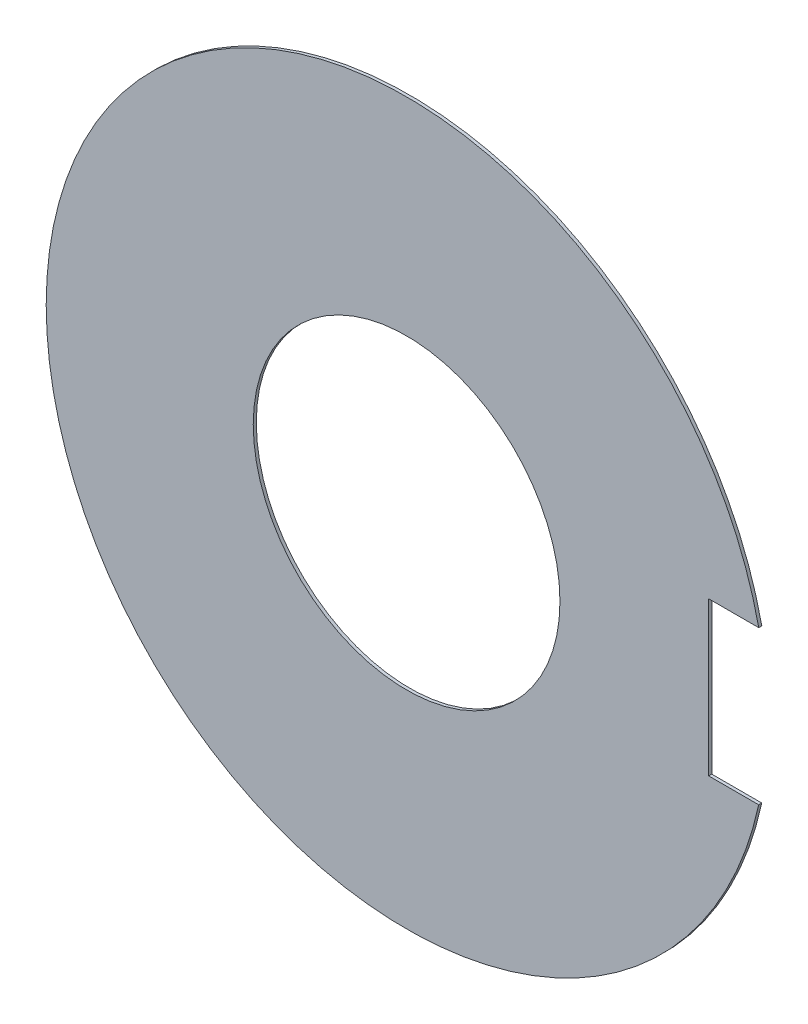
ISO-10303-21;
HEADER;
FILE_DESCRIPTION(('STEP AP214'),'2;1');
FILE_NAME('part.step','',(''),(''),'','','');
FILE_SCHEMA(('AUTOMOTIVE_DESIGN { 1 0 10303 214 1 1 1 1 }'));
ENDSEC;
DATA;
#1=APPLICATION_CONTEXT('core data for automotive mechanical design processes');
#2=APPLICATION_PROTOCOL_DEFINITION('international standard','automotive_design',2000,#1);
#3=PRODUCT_CONTEXT('',#1,'mechanical');
#4=PRODUCT('Part','Part','',(#3));
#5=PRODUCT_RELATED_PRODUCT_CATEGORY('part','',(#4));
#6=PRODUCT_DEFINITION_FORMATION('','',#4);
#7=PRODUCT_DEFINITION_CONTEXT('part definition',#1,'design');
#8=PRODUCT_DEFINITION('design','',#6,#7);
#9=PRODUCT_DEFINITION_SHAPE('','',#8);
#10=(LENGTH_UNIT() NAMED_UNIT(*) SI_UNIT(.MILLI.,.METRE.));
#11=(NAMED_UNIT(*) PLANE_ANGLE_UNIT() SI_UNIT($,.RADIAN.));
#12=(NAMED_UNIT(*) SI_UNIT($,.STERADIAN.) SOLID_ANGLE_UNIT());
#13=UNCERTAINTY_MEASURE_WITH_UNIT(LENGTH_MEASURE(1.E-05),#10,'distance_accuracy_value','');
#14=(GEOMETRIC_REPRESENTATION_CONTEXT(3) GLOBAL_UNCERTAINTY_ASSIGNED_CONTEXT((#13)) GLOBAL_UNIT_ASSIGNED_CONTEXT((#10,
#11,#12)) REPRESENTATION_CONTEXT('',''));
#15=CARTESIAN_POINT('',(0.,0.,0.));
#16=DIRECTION('',(0.,0.,1.));
#17=DIRECTION('',(1.,0.,0.));
#18=AXIS2_PLACEMENT_3D('',#15,#16,#17);
#19=CARTESIAN_POINT('',(0.,0.,0.254));
#20=DIRECTION('',(0.,0.,1.));
#21=DIRECTION('',(1.,0.,0.));
#22=AXIS2_PLACEMENT_3D('',#19,#20,#21);
#23=PLANE('',#22);
#24=DIRECTION('',(-1.,0.,0.));
#25=VECTOR('',#24,1.);
#26=CARTESIAN_POINT('',(25.019,6.35,0.254));
#27=LINE('',#26,#25);
#28=CARTESIAN_POINT('',(29.1616447581408,6.35,0.254));
#29=VERTEX_POINT('',#28);
#30=CARTESIAN_POINT('',(25.019,6.35,0.254));
#31=VERTEX_POINT('',#30);
#32=EDGE_CURVE('E91',#29,#31,#27,.T.);
#33=ORIENTED_EDGE('',*,*,#32,.F.);
#34=CARTESIAN_POINT('',(0.,0.,0.254));
#35=DIRECTION('',(0.,0.,1.));
#36=DIRECTION('',(1.,0.,0.));
#37=AXIS2_PLACEMENT_3D('',#34,#35,#36);
#38=CIRCLE('',#37,29.845);
#39=CARTESIAN_POINT('',(29.1612084631092,-6.35200330376861,0.254));
#40=VERTEX_POINT('',#39);
#41=EDGE_CURVE('E106',#29,#40,#38,.T.);
#42=ORIENTED_EDGE('',*,*,#41,.T.);
#43=DIRECTION('',(1.,0.,0.));
#44=VECTOR('',#43,1.);
#45=CARTESIAN_POINT('',(25.019,-6.35200330376861,0.254));
#46=LINE('',#45,#44);
#47=CARTESIAN_POINT('',(25.019,-6.35200330376861,0.254));
#48=VERTEX_POINT('',#47);
#49=EDGE_CURVE('E48',#48,#40,#46,.T.);
#50=ORIENTED_EDGE('',*,*,#49,.F.);
#51=DIRECTION('',(0.,-1.,0.));
#52=VECTOR('',#51,1.);
#53=CARTESIAN_POINT('',(25.019,6.35,0.254));
#54=LINE('',#53,#52);
#55=EDGE_CURVE('E79',#31,#48,#54,.T.);
#56=ORIENTED_EDGE('',*,*,#55,.F.);
#57=EDGE_LOOP('',(#33,#42,#50,#56));
#58=FACE_BOUND('',#57,.T.);
#59=CARTESIAN_POINT('',(0.,0.,0.254));
#60=DIRECTION('',(0.,0.,1.));
#61=DIRECTION('',(1.,0.,0.));
#62=AXIS2_PLACEMENT_3D('',#59,#60,#61);
#63=CIRCLE('',#62,12.7);
#64=CARTESIAN_POINT('',(12.7,0.,0.254));
#65=VERTEX_POINT('',#64);
#66=EDGE_CURVE('E100',#65,#65,#63,.T.);
#67=ORIENTED_EDGE('',*,*,#66,.F.);
#68=EDGE_LOOP('',(#67));
#69=FACE_BOUND('',#68,.T.);
#70=ADVANCED_FACE('F33',(#58,#69),#23,.T.);
#71=CARTESIAN_POINT('',(0.,0.,0.));
#72=DIRECTION('',(0.,0.,1.));
#73=DIRECTION('',(1.,0.,0.));
#74=AXIS2_PLACEMENT_3D('',#71,#72,#73);
#75=PLANE('',#74);
#76=CARTESIAN_POINT('',(0.,0.,0.));
#77=DIRECTION('',(0.,0.,1.));
#78=DIRECTION('',(1.,0.,0.));
#79=AXIS2_PLACEMENT_3D('',#76,#77,#78);
#80=CIRCLE('',#79,29.845);
#81=CARTESIAN_POINT('',(29.1616447581408,6.35,0.));
#82=VERTEX_POINT('',#81);
#83=CARTESIAN_POINT('',(29.1612084631092,-6.35200330376861,0.));
#84=VERTEX_POINT('',#83);
#85=EDGE_CURVE('E103',#82,#84,#80,.T.);
#86=ORIENTED_EDGE('',*,*,#85,.F.);
#87=DIRECTION('',(-1.,0.,0.));
#88=VECTOR('',#87,1.);
#89=CARTESIAN_POINT('',(25.019,6.35,0.));
#90=LINE('',#89,#88);
#91=CARTESIAN_POINT('',(25.019,6.35,0.));
#92=VERTEX_POINT('',#91);
#93=EDGE_CURVE('E81',#82,#92,#90,.T.);
#94=ORIENTED_EDGE('',*,*,#93,.T.);
#95=DIRECTION('',(0.,-1.,0.));
#96=VECTOR('',#95,1.);
#97=CARTESIAN_POINT('',(25.019,6.35,0.));
#98=LINE('',#97,#96);
#99=CARTESIAN_POINT('',(25.019,-6.35200330376861,0.));
#100=VERTEX_POINT('',#99);
#101=EDGE_CURVE('E76',#92,#100,#98,.T.);
#102=ORIENTED_EDGE('',*,*,#101,.T.);
#103=DIRECTION('',(1.,0.,0.));
#104=VECTOR('',#103,1.);
#105=CARTESIAN_POINT('',(25.019,-6.35200330376861,0.));
#106=LINE('',#105,#104);
#107=EDGE_CURVE('E83',#100,#84,#106,.T.);
#108=ORIENTED_EDGE('',*,*,#107,.T.);
#109=EDGE_LOOP('',(#86,#94,#102,#108));
#110=FACE_BOUND('',#109,.T.);
#111=CARTESIAN_POINT('',(0.,0.,0.));
#112=DIRECTION('',(0.,0.,1.));
#113=DIRECTION('',(1.,0.,0.));
#114=AXIS2_PLACEMENT_3D('',#111,#112,#113);
#115=CIRCLE('',#114,12.7);
#116=CARTESIAN_POINT('',(12.7,0.,0.));
#117=VERTEX_POINT('',#116);
#118=EDGE_CURVE('E98',#117,#117,#115,.T.);
#119=ORIENTED_EDGE('',*,*,#118,.T.);
#120=EDGE_LOOP('',(#119));
#121=FACE_BOUND('',#120,.T.);
#122=ADVANCED_FACE('F89',(#110,#121),#75,.F.);
#123=CARTESIAN_POINT('',(0.,0.,0.254));
#124=DIRECTION('',(0.,0.,-1.));
#125=DIRECTION('',(-1.,0.,0.));
#126=AXIS2_PLACEMENT_3D('',#123,#124,#125);
#127=CYLINDRICAL_SURFACE('',#126,29.845);
#128=ORIENTED_EDGE('',*,*,#41,.F.);
#129=DIRECTION('',(0.,0.,-1.));
#130=VECTOR('',#129,1.);
#131=CARTESIAN_POINT('',(29.1616447581408,6.35,0.254));
#132=LINE('',#131,#130);
#133=EDGE_CURVE('E11',#29,#82,#132,.T.);
#134=ORIENTED_EDGE('',*,*,#133,.T.);
#135=ORIENTED_EDGE('',*,*,#85,.T.);
#136=DIRECTION('',(0.,0.,-1.));
#137=VECTOR('',#136,1.);
#138=CARTESIAN_POINT('',(29.1612084631092,-6.35200330376861,0.254));
#139=LINE('',#138,#137);
#140=EDGE_CURVE('E41',#84,#40,#139,.F.);
#141=ORIENTED_EDGE('',*,*,#140,.T.);
#142=EDGE_LOOP('',(#128,#134,#135,#141));
#143=FACE_BOUND('',#142,.T.);
#144=ADVANCED_FACE('F35',(#143),#127,.T.);
#145=CARTESIAN_POINT('',(0.,0.,0.254));
#146=DIRECTION('',(0.,0.,-1.));
#147=DIRECTION('',(-1.,0.,0.));
#148=AXIS2_PLACEMENT_3D('',#145,#146,#147);
#149=CYLINDRICAL_SURFACE('',#148,12.7);
#150=ORIENTED_EDGE('',*,*,#66,.T.);
#151=EDGE_LOOP('',(#150));
#152=FACE_BOUND('',#151,.T.);
#153=ORIENTED_EDGE('',*,*,#118,.F.);
#154=EDGE_LOOP('',(#153));
#155=FACE_BOUND('',#154,.T.);
#156=ADVANCED_FACE('F117',(#152,#155),#149,.F.);
#157=CARTESIAN_POINT('',(25.019,6.35,0.));
#158=DIRECTION('',(0.,1.,0.));
#159=DIRECTION('',(0.,0.,1.));
#160=AXIS2_PLACEMENT_3D('',#157,#158,#159);
#161=PLANE('',#160);
#162=ORIENTED_EDGE('',*,*,#32,.T.);
#163=DIRECTION('',(0.,0.,1.));
#164=VECTOR('',#163,1.);
#165=CARTESIAN_POINT('',(25.019,6.35,0.));
#166=LINE('',#165,#164);
#167=EDGE_CURVE('E80',#92,#31,#166,.T.);
#168=ORIENTED_EDGE('',*,*,#167,.F.);
#169=ORIENTED_EDGE('',*,*,#93,.F.);
#170=ORIENTED_EDGE('',*,*,#133,.F.);
#171=EDGE_LOOP('',(#162,#168,#169,#170));
#172=FACE_BOUND('',#171,.T.);
#173=ADVANCED_FACE('F115',(#172),#161,.F.);
#174=CARTESIAN_POINT('',(25.019,-6.35200330376861,0.));
#175=DIRECTION('',(0.,-1.,0.));
#176=DIRECTION('',(0.,0.,-1.));
#177=AXIS2_PLACEMENT_3D('',#174,#175,#176);
#178=PLANE('',#177);
#179=ORIENTED_EDGE('',*,*,#107,.F.);
#180=DIRECTION('',(0.,0.,1.));
#181=VECTOR('',#180,1.);
#182=CARTESIAN_POINT('',(25.019,-6.35200330376861,0.));
#183=LINE('',#182,#181);
#184=EDGE_CURVE('E72',#100,#48,#183,.T.);
#185=ORIENTED_EDGE('',*,*,#184,.T.);
#186=ORIENTED_EDGE('',*,*,#49,.T.);
#187=ORIENTED_EDGE('',*,*,#140,.F.);
#188=EDGE_LOOP('',(#179,#185,#186,#187));
#189=FACE_BOUND('',#188,.T.);
#190=ADVANCED_FACE('F84',(#189),#178,.F.);
#191=CARTESIAN_POINT('',(25.019,6.35,0.));
#192=DIRECTION('',(-1.,0.,0.));
#193=DIRECTION('',(0.,0.,1.));
#194=AXIS2_PLACEMENT_3D('',#191,#192,#193);
#195=PLANE('',#194);
#196=ORIENTED_EDGE('',*,*,#55,.T.);
#197=ORIENTED_EDGE('',*,*,#184,.F.);
#198=ORIENTED_EDGE('',*,*,#101,.F.);
#199=ORIENTED_EDGE('',*,*,#167,.T.);
#200=EDGE_LOOP('',(#196,#197,#198,#199));
#201=FACE_BOUND('',#200,.T.);
#202=ADVANCED_FACE('F73',(#201),#195,.F.);
#203=CLOSED_SHELL('',(#70,#122,#144,#156,#173,#190,#202));
#204=MANIFOLD_SOLID_BREP('B2',#203);
#205=ADVANCED_BREP_SHAPE_REPRESENTATION('',(#18,#204),#14);
#206=SHAPE_DEFINITION_REPRESENTATION(#9,#205);
ENDSEC;
END-ISO-10303-21;
